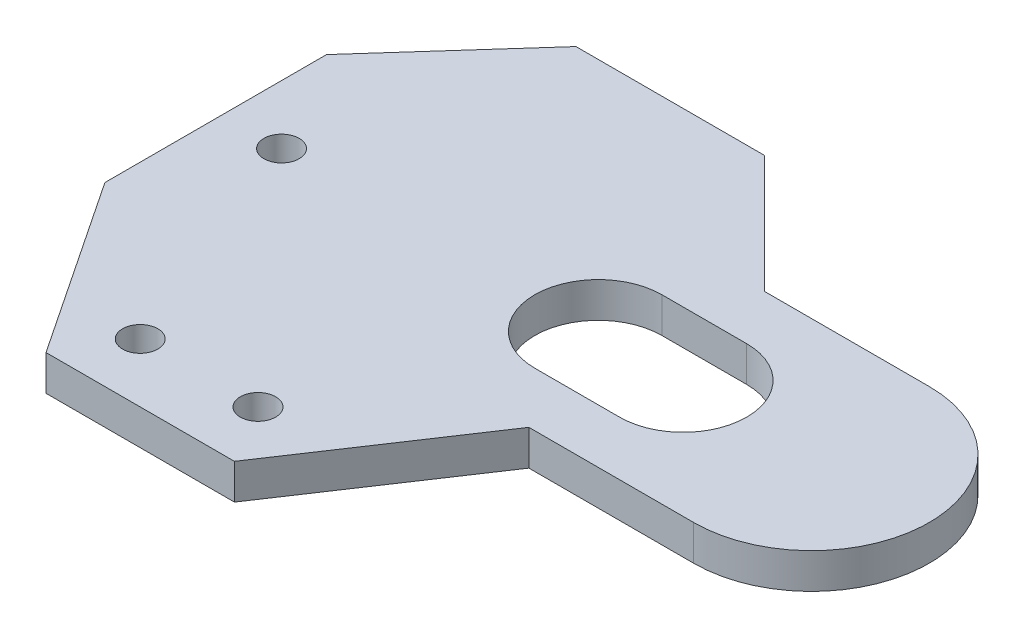
ISO-10303-21;
HEADER;
FILE_DESCRIPTION(('STEP AP214'),'2;1');
FILE_NAME('part.step','',(''),(''),'','','');
FILE_SCHEMA(('AUTOMOTIVE_DESIGN { 1 0 10303 214 1 1 1 1 }'));
ENDSEC;
DATA;
#1=APPLICATION_CONTEXT('core data for automotive mechanical design processes');
#2=APPLICATION_PROTOCOL_DEFINITION('international standard','automotive_design',2000,#1);
#3=PRODUCT_CONTEXT('',#1,'mechanical');
#4=PRODUCT('Part','Part','',(#3));
#5=PRODUCT_RELATED_PRODUCT_CATEGORY('part','',(#4));
#6=PRODUCT_DEFINITION_FORMATION('','',#4);
#7=PRODUCT_DEFINITION_CONTEXT('part definition',#1,'design');
#8=PRODUCT_DEFINITION('design','',#6,#7);
#9=PRODUCT_DEFINITION_SHAPE('','',#8);
#10=(LENGTH_UNIT() NAMED_UNIT(*) SI_UNIT(.MILLI.,.METRE.));
#11=(NAMED_UNIT(*) PLANE_ANGLE_UNIT() SI_UNIT($,.RADIAN.));
#12=(NAMED_UNIT(*) SI_UNIT($,.STERADIAN.) SOLID_ANGLE_UNIT());
#13=UNCERTAINTY_MEASURE_WITH_UNIT(LENGTH_MEASURE(1.E-05),#10,'distance_accuracy_value','');
#14=(GEOMETRIC_REPRESENTATION_CONTEXT(3) GLOBAL_UNCERTAINTY_ASSIGNED_CONTEXT((#13)) GLOBAL_UNIT_ASSIGNED_CONTEXT((#10,
#11,#12)) REPRESENTATION_CONTEXT('',''));
#15=CARTESIAN_POINT('',(0.,0.,0.));
#16=DIRECTION('',(0.,0.,1.));
#17=DIRECTION('',(1.,0.,0.));
#18=AXIS2_PLACEMENT_3D('',#15,#16,#17);
#19=CARTESIAN_POINT('',(39.1,0.,-25.));
#20=DIRECTION('',(0.,-1.,0.));
#21=DIRECTION('',(0.,0.,-1.));
#22=AXIS2_PLACEMENT_3D('',#19,#20,#21);
#23=CYLINDRICAL_SURFACE('',#22,5.4);
#24=DIRECTION('',(0.,1.,0.));
#25=VECTOR('',#24,1.);
#26=CARTESIAN_POINT('',(39.1,0.,-30.4));
#27=LINE('',#26,#25);
#28=CARTESIAN_POINT('',(39.1,0.,-30.4));
#29=VERTEX_POINT('',#28);
#30=CARTESIAN_POINT('',(39.1,3.,-30.4));
#31=VERTEX_POINT('',#30);
#32=EDGE_CURVE('E248',#29,#31,#27,.T.);
#33=ORIENTED_EDGE('',*,*,#32,.F.);
#34=CARTESIAN_POINT('',(39.1,0.,-25.));
#35=DIRECTION('',(0.,1.,0.));
#36=DIRECTION('',(0.,0.,1.));
#37=AXIS2_PLACEMENT_3D('',#34,#35,#36);
#38=CIRCLE('',#37,5.4);
#39=CARTESIAN_POINT('',(39.1,0.,-19.6));
#40=VERTEX_POINT('',#39);
#41=EDGE_CURVE('E43',#29,#40,#38,.F.);
#42=ORIENTED_EDGE('',*,*,#41,.T.);
#43=DIRECTION('',(0.,-1.,0.));
#44=VECTOR('',#43,1.);
#45=CARTESIAN_POINT('',(39.1,3.,-19.6));
#46=LINE('',#45,#44);
#47=CARTESIAN_POINT('',(39.1,3.,-19.6));
#48=VERTEX_POINT('',#47);
#49=EDGE_CURVE('E251',#48,#40,#46,.T.);
#50=ORIENTED_EDGE('',*,*,#49,.F.);
#51=CARTESIAN_POINT('',(39.1,3.,-25.));
#52=DIRECTION('',(0.,1.,0.));
#53=DIRECTION('',(0.,0.,1.));
#54=AXIS2_PLACEMENT_3D('',#51,#52,#53);
#55=CIRCLE('',#54,5.4);
#56=EDGE_CURVE('E11',#48,#31,#55,.T.);
#57=ORIENTED_EDGE('',*,*,#56,.T.);
#58=EDGE_LOOP('',(#33,#42,#50,#57));
#59=FACE_BOUND('',#58,.T.);
#60=ADVANCED_FACE('F36',(#59),#23,.F.);
#61=CARTESIAN_POINT('',(31.9,0.,-25.));
#62=DIRECTION('',(0.,-1.,0.));
#63=DIRECTION('',(0.,0.,-1.));
#64=AXIS2_PLACEMENT_3D('',#61,#62,#63);
#65=CYLINDRICAL_SURFACE('',#64,5.4);
#66=DIRECTION('',(0.,1.,0.));
#67=VECTOR('',#66,1.);
#68=CARTESIAN_POINT('',(31.9,0.,-19.6));
#69=LINE('',#68,#67);
#70=CARTESIAN_POINT('',(31.9,0.,-19.6));
#71=VERTEX_POINT('',#70);
#72=CARTESIAN_POINT('',(31.9,3.,-19.6));
#73=VERTEX_POINT('',#72);
#74=EDGE_CURVE('E236',#71,#73,#69,.T.);
#75=ORIENTED_EDGE('',*,*,#74,.F.);
#76=CARTESIAN_POINT('',(31.9,0.,-25.));
#77=DIRECTION('',(0.,1.,0.));
#78=DIRECTION('',(0.,0.,1.));
#79=AXIS2_PLACEMENT_3D('',#76,#77,#78);
#80=CIRCLE('',#79,5.4);
#81=CARTESIAN_POINT('',(31.9,0.,-30.4));
#82=VERTEX_POINT('',#81);
#83=EDGE_CURVE('E242',#71,#82,#80,.F.);
#84=ORIENTED_EDGE('',*,*,#83,.T.);
#85=DIRECTION('',(0.,-1.,0.));
#86=VECTOR('',#85,1.);
#87=CARTESIAN_POINT('',(31.9,3.,-30.4));
#88=LINE('',#87,#86);
#89=CARTESIAN_POINT('',(31.9,3.,-30.4));
#90=VERTEX_POINT('',#89);
#91=EDGE_CURVE('E239',#90,#82,#88,.T.);
#92=ORIENTED_EDGE('',*,*,#91,.F.);
#93=CARTESIAN_POINT('',(31.9,3.,-25.));
#94=DIRECTION('',(0.,1.,0.));
#95=DIRECTION('',(0.,0.,1.));
#96=AXIS2_PLACEMENT_3D('',#93,#94,#95);
#97=CIRCLE('',#96,5.4);
#98=EDGE_CURVE('E245',#90,#73,#97,.T.);
#99=ORIENTED_EDGE('',*,*,#98,.T.);
#100=EDGE_LOOP('',(#75,#84,#92,#99));
#101=FACE_BOUND('',#100,.T.);
#102=ADVANCED_FACE('F265',(#101),#65,.F.);
#103=CARTESIAN_POINT('',(50.,3.,-25.));
#104=DIRECTION('',(0.,-1.,0.));
#105=DIRECTION('',(0.,0.,-1.));
#106=AXIS2_PLACEMENT_3D('',#103,#104,#105);
#107=CYLINDRICAL_SURFACE('',#106,10.);
#108=DIRECTION('',(0.,1.,0.));
#109=VECTOR('',#108,1.);
#110=CARTESIAN_POINT('',(50.,3.,-35.));
#111=LINE('',#110,#109);
#112=CARTESIAN_POINT('',(50.,3.,-35.));
#113=VERTEX_POINT('',#112);
#114=CARTESIAN_POINT('',(50.,0.,-35.));
#115=VERTEX_POINT('',#114);
#116=EDGE_CURVE('E144',#113,#115,#111,.F.);
#117=ORIENTED_EDGE('',*,*,#116,.F.);
#118=CARTESIAN_POINT('',(50.,3.,-25.));
#119=DIRECTION('',(0.,1.,0.));
#120=DIRECTION('',(0.,0.,1.));
#121=AXIS2_PLACEMENT_3D('',#118,#119,#120);
#122=CIRCLE('',#121,10.);
#123=CARTESIAN_POINT('',(50.,3.,-15.));
#124=VERTEX_POINT('',#123);
#125=EDGE_CURVE('E154',#124,#113,#122,.T.);
#126=ORIENTED_EDGE('',*,*,#125,.F.);
#127=DIRECTION('',(0.,-1.,0.));
#128=VECTOR('',#127,1.);
#129=CARTESIAN_POINT('',(50.,3.,-15.));
#130=LINE('',#129,#128);
#131=CARTESIAN_POINT('',(50.,0.,-15.));
#132=VERTEX_POINT('',#131);
#133=EDGE_CURVE('E230',#132,#124,#130,.F.);
#134=ORIENTED_EDGE('',*,*,#133,.F.);
#135=CARTESIAN_POINT('',(50.,0.,-25.));
#136=DIRECTION('',(0.,1.,0.));
#137=DIRECTION('',(0.,0.,1.));
#138=AXIS2_PLACEMENT_3D('',#135,#136,#137);
#139=CIRCLE('',#138,10.);
#140=EDGE_CURVE('E234',#115,#132,#139,.F.);
#141=ORIENTED_EDGE('',*,*,#140,.F.);
#142=EDGE_LOOP('',(#117,#126,#134,#141));
#143=FACE_BOUND('',#142,.T.);
#144=ADVANCED_FACE('F297',(#143),#107,.T.);
#145=CARTESIAN_POINT('',(-28.4777308041275,3.,-35.));
#146=DIRECTION('',(0.,0.,-1.));
#147=DIRECTION('',(-1.,0.,0.));
#148=AXIS2_PLACEMENT_3D('',#145,#146,#147);
#149=PLANE('',#148);
#150=DIRECTION('',(1.,0.,0.));
#151=VECTOR('',#150,1.);
#152=CARTESIAN_POINT('',(-28.4777308041275,3.,-35.));
#153=LINE('',#152,#151);
#154=CARTESIAN_POINT('',(36.,3.,-35.));
#155=VERTEX_POINT('',#154);
#156=EDGE_CURVE('E137',#155,#113,#153,.T.);
#157=ORIENTED_EDGE('',*,*,#156,.T.);
#158=ORIENTED_EDGE('',*,*,#116,.T.);
#159=DIRECTION('',(1.,0.,0.));
#160=VECTOR('',#159,1.);
#161=CARTESIAN_POINT('',(-28.4777308041275,0.,-35.));
#162=LINE('',#161,#160);
#163=CARTESIAN_POINT('',(36.,0.,-35.));
#164=VERTEX_POINT('',#163);
#165=EDGE_CURVE('E139',#164,#115,#162,.T.);
#166=ORIENTED_EDGE('',*,*,#165,.F.);
#167=DIRECTION('',(0.,-1.,0.));
#168=VECTOR('',#167,1.);
#169=CARTESIAN_POINT('',(36.,3.,-35.));
#170=LINE('',#169,#168);
#171=EDGE_CURVE('E133',#155,#164,#170,.T.);
#172=ORIENTED_EDGE('',*,*,#171,.F.);
#173=EDGE_LOOP('',(#157,#158,#166,#172));
#174=FACE_BOUND('',#173,.T.);
#175=ADVANCED_FACE('F135',(#174),#149,.T.);
#176=CARTESIAN_POINT('',(10.0111345979362,3.,-60.9888654020637));
#177=DIRECTION('',(0.707106781186547,0.,-0.707106781186548));
#178=DIRECTION('',(-0.707106781186548,0.,-0.707106781186547));
#179=AXIS2_PLACEMENT_3D('',#176,#177,#178);
#180=PLANE('',#179);
#181=DIRECTION('',(0.707106781186548,0.,0.707106781186547));
#182=VECTOR('',#181,1.);
#183=CARTESIAN_POINT('',(10.0111345979362,0.,-60.9888654020637));
#184=LINE('',#183,#182);
#185=CARTESIAN_POINT('',(26.,0.,-45.));
#186=VERTEX_POINT('',#185);
#187=EDGE_CURVE('E193',#186,#164,#184,.T.);
#188=ORIENTED_EDGE('',*,*,#187,.F.);
#189=DIRECTION('',(0.,-1.,0.));
#190=VECTOR('',#189,1.);
#191=CARTESIAN_POINT('',(26.,3.,-45.));
#192=LINE('',#191,#190);
#193=CARTESIAN_POINT('',(26.,3.,-45.));
#194=VERTEX_POINT('',#193);
#195=EDGE_CURVE('E145',#194,#186,#192,.T.);
#196=ORIENTED_EDGE('',*,*,#195,.F.);
#197=DIRECTION('',(0.707106781186548,0.,0.707106781186547));
#198=VECTOR('',#197,1.);
#199=CARTESIAN_POINT('',(10.0111345979362,3.,-60.9888654020637));
#200=LINE('',#199,#198);
#201=EDGE_CURVE('E152',#194,#155,#200,.T.);
#202=ORIENTED_EDGE('',*,*,#201,.T.);
#203=ORIENTED_EDGE('',*,*,#171,.T.);
#204=EDGE_LOOP('',(#188,#196,#202,#203));
#205=FACE_BOUND('',#204,.T.);
#206=ADVANCED_FACE('F158',(#205),#180,.T.);
#207=CARTESIAN_POINT('',(-28.4777308041275,3.,-45.));
#208=DIRECTION('',(0.,0.,-1.));
#209=DIRECTION('',(-1.,0.,0.));
#210=AXIS2_PLACEMENT_3D('',#207,#208,#209);
#211=PLANE('',#210);
#212=DIRECTION('',(1.,0.,0.));
#213=VECTOR('',#212,1.);
#214=CARTESIAN_POINT('',(-28.4777308041275,0.,-45.));
#215=LINE('',#214,#213);
#216=CARTESIAN_POINT('',(10.,0.,-45.));
#217=VERTEX_POINT('',#216);
#218=EDGE_CURVE('E195',#217,#186,#215,.T.);
#219=ORIENTED_EDGE('',*,*,#218,.F.);
#220=DIRECTION('',(0.,-1.,0.));
#221=VECTOR('',#220,1.);
#222=CARTESIAN_POINT('',(10.,3.,-45.));
#223=LINE('',#222,#221);
#224=CARTESIAN_POINT('',(10.,3.,-45.));
#225=VERTEX_POINT('',#224);
#226=EDGE_CURVE('E226',#225,#217,#223,.T.);
#227=ORIENTED_EDGE('',*,*,#226,.F.);
#228=DIRECTION('',(1.,0.,0.));
#229=VECTOR('',#228,1.);
#230=CARTESIAN_POINT('',(-28.4777308041275,3.,-45.));
#231=LINE('',#230,#229);
#232=EDGE_CURVE('E159',#225,#194,#231,.T.);
#233=ORIENTED_EDGE('',*,*,#232,.T.);
#234=ORIENTED_EDGE('',*,*,#195,.T.);
#235=EDGE_LOOP('',(#219,#227,#233,#234));
#236=FACE_BOUND('',#235,.T.);
#237=ADVANCED_FACE('F325',(#236),#211,.T.);
#238=CARTESIAN_POINT('',(-18.2815535782223,3.,-13.3802618448963));
#239=DIRECTION('',(-0.74535599249993,0.,-0.666666666666667));
#240=DIRECTION('',(-0.666666666666667,0.,0.74535599249993));
#241=AXIS2_PLACEMENT_3D('',#238,#239,#240);
#242=PLANE('',#241);
#243=DIRECTION('',(0.666666666666667,0.,-0.74535599249993));
#244=VECTOR('',#243,1.);
#245=CARTESIAN_POINT('',(-18.2815535782223,0.,-13.3802618448963));
#246=LINE('',#245,#244);
#247=CARTESIAN_POINT('',(0.,0.,-33.8196601125011));
#248=VERTEX_POINT('',#247);
#249=EDGE_CURVE('E198',#248,#217,#246,.T.);
#250=ORIENTED_EDGE('',*,*,#249,.F.);
#251=DIRECTION('',(0.,-1.,0.));
#252=VECTOR('',#251,1.);
#253=CARTESIAN_POINT('',(0.,3.,-33.8196601125011));
#254=LINE('',#253,#252);
#255=CARTESIAN_POINT('',(0.,3.,-33.8196601125011));
#256=VERTEX_POINT('',#255);
#257=EDGE_CURVE('E224',#256,#248,#254,.T.);
#258=ORIENTED_EDGE('',*,*,#257,.F.);
#259=DIRECTION('',(0.666666666666667,0.,-0.74535599249993));
#260=VECTOR('',#259,1.);
#261=CARTESIAN_POINT('',(-18.2815535782223,3.,-13.3802618448963));
#262=LINE('',#261,#260);
#263=EDGE_CURVE('E161',#256,#225,#262,.T.);
#264=ORIENTED_EDGE('',*,*,#263,.T.);
#265=ORIENTED_EDGE('',*,*,#226,.T.);
#266=EDGE_LOOP('',(#250,#258,#264,#265));
#267=FACE_BOUND('',#266,.T.);
#268=ADVANCED_FACE('F329',(#267),#242,.T.);
#269=CARTESIAN_POINT('',(0.,3.,-22.5));
#270=DIRECTION('',(-1.,0.,0.));
#271=DIRECTION('',(0.,0.,1.));
#272=AXIS2_PLACEMENT_3D('',#269,#270,#271);
#273=PLANE('',#272);
#274=DIRECTION('',(0.,0.,-1.));
#275=VECTOR('',#274,1.);
#276=CARTESIAN_POINT('',(0.,0.,-22.5));
#277=LINE('',#276,#275);
#278=CARTESIAN_POINT('',(0.,0.,-15.));
#279=VERTEX_POINT('',#278);
#280=EDGE_CURVE('E201',#279,#248,#277,.T.);
#281=ORIENTED_EDGE('',*,*,#280,.F.);
#282=DIRECTION('',(0.,-1.,0.));
#283=VECTOR('',#282,1.);
#284=CARTESIAN_POINT('',(0.,3.,-15.));
#285=LINE('',#284,#283);
#286=CARTESIAN_POINT('',(0.,3.,-15.));
#287=VERTEX_POINT('',#286);
#288=EDGE_CURVE('E222',#287,#279,#285,.T.);
#289=ORIENTED_EDGE('',*,*,#288,.F.);
#290=DIRECTION('',(0.,0.,-1.));
#291=VECTOR('',#290,1.);
#292=CARTESIAN_POINT('',(0.,3.,-22.5));
#293=LINE('',#292,#291);
#294=EDGE_CURVE('E167',#287,#256,#293,.T.);
#295=ORIENTED_EDGE('',*,*,#294,.T.);
#296=ORIENTED_EDGE('',*,*,#257,.T.);
#297=EDGE_LOOP('',(#281,#289,#295,#296));
#298=FACE_BOUND('',#297,.T.);
#299=ADVANCED_FACE('F332',(#298),#273,.T.);
#300=CARTESIAN_POINT('',(-12.2239171705008,3.,-33.3358757557511));
#301=DIRECTION('',(0.832050294337843,0.,-0.554700196225229));
#302=DIRECTION('',(-0.554700196225229,0.,-0.832050294337844));
#303=AXIS2_PLACEMENT_3D('',#300,#301,#302);
#304=PLANE('',#303);
#305=DIRECTION('',(0.554700196225229,0.,0.832050294337844));
#306=VECTOR('',#305,1.);
#307=CARTESIAN_POINT('',(-12.2239171705008,0.,-33.3358757557511));
#308=LINE('',#307,#306);
#309=CARTESIAN_POINT('',(10.,0.,0.));
#310=VERTEX_POINT('',#309);
#311=EDGE_CURVE('E204',#279,#310,#308,.T.);
#312=ORIENTED_EDGE('',*,*,#311,.T.);
#313=DIRECTION('',(0.,-1.,0.));
#314=VECTOR('',#313,1.);
#315=CARTESIAN_POINT('',(10.,3.,0.));
#316=LINE('',#315,#314);
#317=CARTESIAN_POINT('',(10.,3.,0.));
#318=VERTEX_POINT('',#317);
#319=EDGE_CURVE('E219',#318,#310,#316,.T.);
#320=ORIENTED_EDGE('',*,*,#319,.F.);
#321=DIRECTION('',(0.554700196225229,0.,0.832050294337844));
#322=VECTOR('',#321,1.);
#323=CARTESIAN_POINT('',(-12.2239171705008,3.,-33.3358757557511));
#324=LINE('',#323,#322);
#325=EDGE_CURVE('E170',#287,#318,#324,.T.);
#326=ORIENTED_EDGE('',*,*,#325,.F.);
#327=ORIENTED_EDGE('',*,*,#288,.T.);
#328=EDGE_LOOP('',(#312,#320,#326,#327));
#329=FACE_BOUND('',#328,.T.);
#330=ADVANCED_FACE('F338',(#329),#304,.F.);
#331=CARTESIAN_POINT('',(-28.4777308041275,3.,0.));
#332=DIRECTION('',(0.,0.,-1.));
#333=DIRECTION('',(-1.,0.,0.));
#334=AXIS2_PLACEMENT_3D('',#331,#332,#333);
#335=PLANE('',#334);
#336=DIRECTION('',(1.,0.,0.));
#337=VECTOR('',#336,1.);
#338=CARTESIAN_POINT('',(-28.4777308041275,0.,0.));
#339=LINE('',#338,#337);
#340=CARTESIAN_POINT('',(26.,0.,0.));
#341=VERTEX_POINT('',#340);
#342=EDGE_CURVE('E206',#310,#341,#339,.T.);
#343=ORIENTED_EDGE('',*,*,#342,.T.);
#344=DIRECTION('',(0.,-1.,0.));
#345=VECTOR('',#344,1.);
#346=CARTESIAN_POINT('',(26.,3.,0.));
#347=LINE('',#346,#345);
#348=CARTESIAN_POINT('',(26.,3.,0.));
#349=VERTEX_POINT('',#348);
#350=EDGE_CURVE('E216',#349,#341,#347,.T.);
#351=ORIENTED_EDGE('',*,*,#350,.F.);
#352=DIRECTION('',(1.,0.,0.));
#353=VECTOR('',#352,1.);
#354=CARTESIAN_POINT('',(-28.4777308041275,3.,0.));
#355=LINE('',#354,#353);
#356=EDGE_CURVE('E172',#318,#349,#355,.T.);
#357=ORIENTED_EDGE('',*,*,#356,.F.);
#358=ORIENTED_EDGE('',*,*,#319,.T.);
#359=EDGE_LOOP('',(#343,#351,#357,#358));
#360=FACE_BOUND('',#359,.T.);
#361=ADVANCED_FACE('F308',(#360),#335,.F.);
#362=CARTESIAN_POINT('',(19.6222366756531,3.,9.56664498652037));
#363=DIRECTION('',(-0.832050294337844,0.,-0.554700196225229));
#364=DIRECTION('',(-0.554700196225229,0.,0.832050294337844));
#365=AXIS2_PLACEMENT_3D('',#362,#363,#364);
#366=PLANE('',#365);
#367=DIRECTION('',(0.554700196225229,0.,-0.832050294337844));
#368=VECTOR('',#367,1.);
#369=CARTESIAN_POINT('',(19.6222366756531,0.,9.56664498652037));
#370=LINE('',#369,#368);
#371=CARTESIAN_POINT('',(36.,0.,-15.));
#372=VERTEX_POINT('',#371);
#373=EDGE_CURVE('E208',#341,#372,#370,.T.);
#374=ORIENTED_EDGE('',*,*,#373,.T.);
#375=DIRECTION('',(0.,-1.,0.));
#376=VECTOR('',#375,1.);
#377=CARTESIAN_POINT('',(36.,3.,-15.));
#378=LINE('',#377,#376);
#379=CARTESIAN_POINT('',(36.,3.,-15.));
#380=VERTEX_POINT('',#379);
#381=EDGE_CURVE('E178',#380,#372,#378,.T.);
#382=ORIENTED_EDGE('',*,*,#381,.F.);
#383=DIRECTION('',(0.554700196225229,0.,-0.832050294337844));
#384=VECTOR('',#383,1.);
#385=CARTESIAN_POINT('',(19.6222366756531,3.,9.56664498652037));
#386=LINE('',#385,#384);
#387=EDGE_CURVE('E174',#349,#380,#386,.T.);
#388=ORIENTED_EDGE('',*,*,#387,.F.);
#389=ORIENTED_EDGE('',*,*,#350,.T.);
#390=EDGE_LOOP('',(#374,#382,#388,#389));
#391=FACE_BOUND('',#390,.T.);
#392=ADVANCED_FACE('F301',(#391),#366,.F.);
#393=CARTESIAN_POINT('',(-28.4777308041275,3.,-30.4));
#394=DIRECTION('',(0.,0.,1.));
#395=DIRECTION('',(1.,0.,0.));
#396=AXIS2_PLACEMENT_3D('',#393,#394,#395);
#397=PLANE('',#396);
#398=DIRECTION('',(-1.,0.,0.));
#399=VECTOR('',#398,1.);
#400=CARTESIAN_POINT('',(-28.4777308041275,0.,-30.4));
#401=LINE('',#400,#399);
#402=EDGE_CURVE('E179',#29,#82,#401,.T.);
#403=ORIENTED_EDGE('',*,*,#402,.F.);
#404=ORIENTED_EDGE('',*,*,#32,.T.);
#405=DIRECTION('',(-1.,0.,0.));
#406=VECTOR('',#405,1.);
#407=CARTESIAN_POINT('',(-28.4777308041275,3.,-30.4));
#408=LINE('',#407,#406);
#409=EDGE_CURVE('E213',#31,#90,#408,.T.);
#410=ORIENTED_EDGE('',*,*,#409,.T.);
#411=ORIENTED_EDGE('',*,*,#91,.T.);
#412=EDGE_LOOP('',(#403,#404,#410,#411));
#413=FACE_BOUND('',#412,.T.);
#414=ADVANCED_FACE('F299',(#413),#397,.T.);
#415=CARTESIAN_POINT('',(-28.4777308041275,3.,-19.6));
#416=DIRECTION('',(0.,0.,1.));
#417=DIRECTION('',(1.,0.,0.));
#418=AXIS2_PLACEMENT_3D('',#415,#416,#417);
#419=PLANE('',#418);
#420=DIRECTION('',(-1.,0.,0.));
#421=VECTOR('',#420,1.);
#422=CARTESIAN_POINT('',(-28.4777308041275,3.,-19.6));
#423=LINE('',#422,#421);
#424=EDGE_CURVE('E257',#48,#73,#423,.T.);
#425=ORIENTED_EDGE('',*,*,#424,.F.);
#426=ORIENTED_EDGE('',*,*,#49,.T.);
#427=DIRECTION('',(-1.,0.,0.));
#428=VECTOR('',#427,1.);
#429=CARTESIAN_POINT('',(-28.4777308041275,0.,-19.6));
#430=LINE('',#429,#428);
#431=EDGE_CURVE('E181',#40,#71,#430,.T.);
#432=ORIENTED_EDGE('',*,*,#431,.T.);
#433=ORIENTED_EDGE('',*,*,#74,.T.);
#434=EDGE_LOOP('',(#425,#426,#432,#433));
#435=FACE_BOUND('',#434,.T.);
#436=ADVANCED_FACE('F255',(#435),#419,.F.);
#437=CARTESIAN_POINT('',(23.,3.,-5.));
#438=DIRECTION('',(0.,-1.,0.));
#439=DIRECTION('',(0.,0.,-1.));
#440=AXIS2_PLACEMENT_3D('',#437,#438,#439);
#441=CYLINDRICAL_SURFACE('',#440,1.5);
#442=CARTESIAN_POINT('',(23.,3.,-5.));
#443=DIRECTION('',(0.,1.,0.));
#444=DIRECTION('',(0.,0.,1.));
#445=AXIS2_PLACEMENT_3D('',#442,#443,#444);
#446=CIRCLE('',#445,1.5);
#447=CARTESIAN_POINT('',(23.,3.,-3.5));
#448=VERTEX_POINT('',#447);
#449=EDGE_CURVE('E156',#448,#448,#446,.T.);
#450=ORIENTED_EDGE('',*,*,#449,.T.);
#451=EDGE_LOOP('',(#450));
#452=FACE_BOUND('',#451,.T.);
#453=CARTESIAN_POINT('',(23.,0.,-5.));
#454=DIRECTION('',(0.,1.,0.));
#455=DIRECTION('',(0.,0.,1.));
#456=AXIS2_PLACEMENT_3D('',#453,#454,#455);
#457=CIRCLE('',#456,1.5);
#458=CARTESIAN_POINT('',(23.,0.,-3.5));
#459=VERTEX_POINT('',#458);
#460=EDGE_CURVE('E189',#459,#459,#457,.T.);
#461=ORIENTED_EDGE('',*,*,#460,.F.);
#462=EDGE_LOOP('',(#461));
#463=FACE_BOUND('',#462,.T.);
#464=ADVANCED_FACE('F279',(#452,#463),#441,.F.);
#465=CARTESIAN_POINT('',(13.,3.,-5.));
#466=DIRECTION('',(0.,-1.,0.));
#467=DIRECTION('',(0.,0.,-1.));
#468=AXIS2_PLACEMENT_3D('',#465,#466,#467);
#469=CYLINDRICAL_SURFACE('',#468,1.5);
#470=CARTESIAN_POINT('',(13.,3.,-5.));
#471=DIRECTION('',(0.,1.,0.));
#472=DIRECTION('',(0.,0.,1.));
#473=AXIS2_PLACEMENT_3D('',#470,#471,#472);
#474=CIRCLE('',#473,1.5);
#475=CARTESIAN_POINT('',(13.,3.,-3.5));
#476=VERTEX_POINT('',#475);
#477=EDGE_CURVE('E271',#476,#476,#474,.T.);
#478=ORIENTED_EDGE('',*,*,#477,.T.);
#479=EDGE_LOOP('',(#478));
#480=FACE_BOUND('',#479,.T.);
#481=CARTESIAN_POINT('',(13.,0.,-5.));
#482=DIRECTION('',(0.,1.,0.));
#483=DIRECTION('',(0.,0.,1.));
#484=AXIS2_PLACEMENT_3D('',#481,#482,#483);
#485=CIRCLE('',#484,1.5);
#486=CARTESIAN_POINT('',(13.,0.,-3.5));
#487=VERTEX_POINT('',#486);
#488=EDGE_CURVE('E186',#487,#487,#485,.T.);
#489=ORIENTED_EDGE('',*,*,#488,.F.);
#490=EDGE_LOOP('',(#489));
#491=FACE_BOUND('',#490,.T.);
#492=ADVANCED_FACE('F363',(#480,#491),#469,.F.);
#493=CARTESIAN_POINT('',(5.,3.,-25.));
#494=DIRECTION('',(0.,-1.,0.));
#495=DIRECTION('',(0.,0.,-1.));
#496=AXIS2_PLACEMENT_3D('',#493,#494,#495);
#497=CYLINDRICAL_SURFACE('',#496,1.5);
#498=CARTESIAN_POINT('',(5.,3.,-25.));
#499=DIRECTION('',(0.,1.,0.));
#500=DIRECTION('',(0.,0.,1.));
#501=AXIS2_PLACEMENT_3D('',#498,#499,#500);
#502=CIRCLE('',#501,1.5);
#503=CARTESIAN_POINT('',(5.,3.,-23.5));
#504=VERTEX_POINT('',#503);
#505=EDGE_CURVE('E268',#504,#504,#502,.T.);
#506=ORIENTED_EDGE('',*,*,#505,.T.);
#507=EDGE_LOOP('',(#506));
#508=FACE_BOUND('',#507,.T.);
#509=CARTESIAN_POINT('',(5.,0.,-25.));
#510=DIRECTION('',(0.,1.,0.));
#511=DIRECTION('',(0.,0.,1.));
#512=AXIS2_PLACEMENT_3D('',#509,#510,#511);
#513=CIRCLE('',#512,1.5);
#514=CARTESIAN_POINT('',(5.,0.,-23.5));
#515=VERTEX_POINT('',#514);
#516=EDGE_CURVE('E183',#515,#515,#513,.T.);
#517=ORIENTED_EDGE('',*,*,#516,.F.);
#518=EDGE_LOOP('',(#517));
#519=FACE_BOUND('',#518,.T.);
#520=ADVANCED_FACE('F290',(#508,#519),#497,.F.);
#521=CARTESIAN_POINT('',(-28.4777308041275,3.,-15.));
#522=DIRECTION('',(0.,0.,-1.));
#523=DIRECTION('',(-1.,0.,0.));
#524=AXIS2_PLACEMENT_3D('',#521,#522,#523);
#525=PLANE('',#524);
#526=DIRECTION('',(1.,0.,0.));
#527=VECTOR('',#526,1.);
#528=CARTESIAN_POINT('',(-28.4777308041275,0.,-15.));
#529=LINE('',#528,#527);
#530=EDGE_CURVE('E210',#372,#132,#529,.T.);
#531=ORIENTED_EDGE('',*,*,#530,.T.);
#532=ORIENTED_EDGE('',*,*,#133,.T.);
#533=DIRECTION('',(1.,0.,0.));
#534=VECTOR('',#533,1.);
#535=CARTESIAN_POINT('',(-28.4777308041275,3.,-15.));
#536=LINE('',#535,#534);
#537=EDGE_CURVE('E176',#380,#124,#536,.T.);
#538=ORIENTED_EDGE('',*,*,#537,.F.);
#539=ORIENTED_EDGE('',*,*,#381,.T.);
#540=EDGE_LOOP('',(#531,#532,#538,#539));
#541=FACE_BOUND('',#540,.T.);
#542=ADVANCED_FACE('F283',(#541),#525,.F.);
#543=CARTESIAN_POINT('',(-28.4777308041275,3.,-22.5));
#544=DIRECTION('',(0.,1.,0.));
#545=DIRECTION('',(0.,0.,1.));
#546=AXIS2_PLACEMENT_3D('',#543,#544,#545);
#547=PLANE('',#546);
#548=ORIENTED_EDGE('',*,*,#56,.F.);
#549=ORIENTED_EDGE('',*,*,#424,.T.);
#550=ORIENTED_EDGE('',*,*,#98,.F.);
#551=ORIENTED_EDGE('',*,*,#409,.F.);
#552=EDGE_LOOP('',(#548,#549,#550,#551));
#553=FACE_BOUND('',#552,.T.);
#554=ORIENTED_EDGE('',*,*,#505,.F.);
#555=EDGE_LOOP('',(#554));
#556=FACE_BOUND('',#555,.T.);
#557=ORIENTED_EDGE('',*,*,#477,.F.);
#558=EDGE_LOOP('',(#557));
#559=FACE_BOUND('',#558,.T.);
#560=ORIENTED_EDGE('',*,*,#449,.F.);
#561=EDGE_LOOP('',(#560));
#562=FACE_BOUND('',#561,.T.);
#563=ORIENTED_EDGE('',*,*,#537,.T.);
#564=ORIENTED_EDGE('',*,*,#125,.T.);
#565=ORIENTED_EDGE('',*,*,#156,.F.);
#566=ORIENTED_EDGE('',*,*,#201,.F.);
#567=ORIENTED_EDGE('',*,*,#232,.F.);
#568=ORIENTED_EDGE('',*,*,#263,.F.);
#569=ORIENTED_EDGE('',*,*,#294,.F.);
#570=ORIENTED_EDGE('',*,*,#325,.T.);
#571=ORIENTED_EDGE('',*,*,#356,.T.);
#572=ORIENTED_EDGE('',*,*,#387,.T.);
#573=EDGE_LOOP('',(#563,#564,#565,#566,#567,#568,#569,#570,#571,#572));
#574=FACE_BOUND('',#573,.T.);
#575=ADVANCED_FACE('F150',(#553,#556,#559,#562,#574),#547,.T.);
#576=CARTESIAN_POINT('',(-28.4777308041275,0.,-22.5));
#577=DIRECTION('',(0.,1.,0.));
#578=DIRECTION('',(0.,0.,1.));
#579=AXIS2_PLACEMENT_3D('',#576,#577,#578);
#580=PLANE('',#579);
#581=ORIENTED_EDGE('',*,*,#41,.F.);
#582=ORIENTED_EDGE('',*,*,#402,.T.);
#583=ORIENTED_EDGE('',*,*,#83,.F.);
#584=ORIENTED_EDGE('',*,*,#431,.F.);
#585=EDGE_LOOP('',(#581,#582,#583,#584));
#586=FACE_BOUND('',#585,.T.);
#587=ORIENTED_EDGE('',*,*,#516,.T.);
#588=EDGE_LOOP('',(#587));
#589=FACE_BOUND('',#588,.T.);
#590=ORIENTED_EDGE('',*,*,#488,.T.);
#591=EDGE_LOOP('',(#590));
#592=FACE_BOUND('',#591,.T.);
#593=ORIENTED_EDGE('',*,*,#460,.T.);
#594=EDGE_LOOP('',(#593));
#595=FACE_BOUND('',#594,.T.);
#596=ORIENTED_EDGE('',*,*,#165,.T.);
#597=ORIENTED_EDGE('',*,*,#140,.T.);
#598=ORIENTED_EDGE('',*,*,#530,.F.);
#599=ORIENTED_EDGE('',*,*,#373,.F.);
#600=ORIENTED_EDGE('',*,*,#342,.F.);
#601=ORIENTED_EDGE('',*,*,#311,.F.);
#602=ORIENTED_EDGE('',*,*,#280,.T.);
#603=ORIENTED_EDGE('',*,*,#249,.T.);
#604=ORIENTED_EDGE('',*,*,#218,.T.);
#605=ORIENTED_EDGE('',*,*,#187,.T.);
#606=EDGE_LOOP('',(#596,#597,#598,#599,#600,#601,#602,#603,#604,#605));
#607=FACE_BOUND('',#606,.T.);
#608=ADVANCED_FACE('F259',(#586,#589,#592,#595,#607),#580,.F.);
#609=CLOSED_SHELL('',(#60,#102,#144,#175,#206,#237,#268,#299,#330,#361,#392,#414,#436,#464,#492,
#520,#542,#575,#608));
#610=MANIFOLD_SOLID_BREP('B2',#609);
#611=ADVANCED_BREP_SHAPE_REPRESENTATION('',(#18,#610),#14);
#612=SHAPE_DEFINITION_REPRESENTATION(#9,#611);
ENDSEC;
END-ISO-10303-21;
